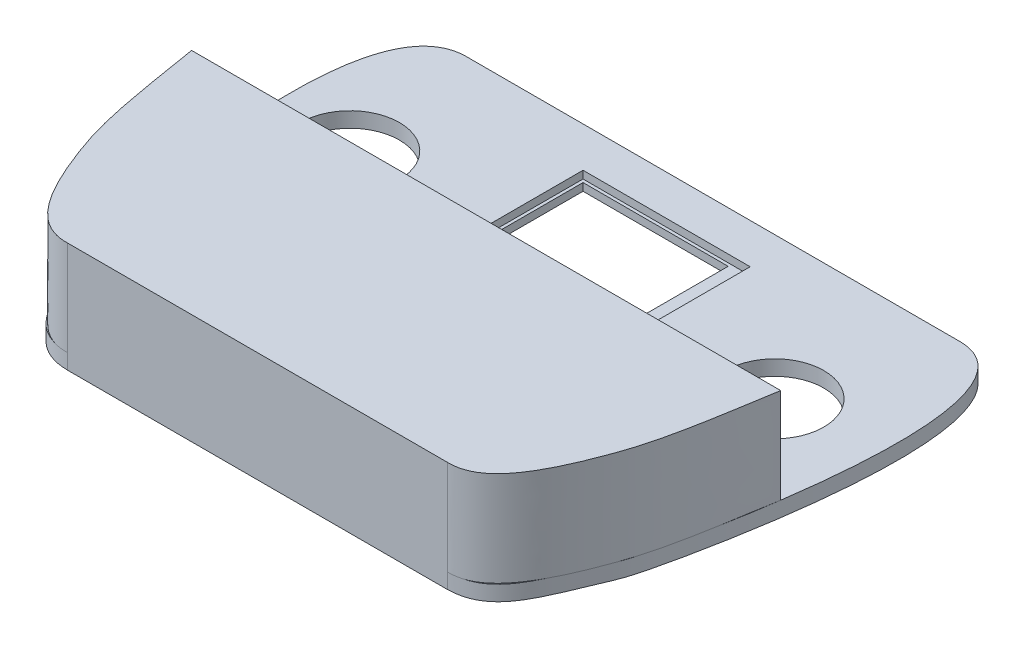
ISO-10303-21;
HEADER;
FILE_DESCRIPTION(('STEP AP214'),'2;1');
FILE_NAME('part.step','',(''),(''),'','','');
FILE_SCHEMA(('AUTOMOTIVE_DESIGN { 1 0 10303 214 1 1 1 1 }'));
ENDSEC;
DATA;
#1=APPLICATION_CONTEXT('core data for automotive mechanical design processes');
#2=APPLICATION_PROTOCOL_DEFINITION('international standard','automotive_design',2000,#1);
#3=PRODUCT_CONTEXT('',#1,'mechanical');
#4=PRODUCT('Part','Part','',(#3));
#5=PRODUCT_RELATED_PRODUCT_CATEGORY('part','',(#4));
#6=PRODUCT_DEFINITION_FORMATION('','',#4);
#7=PRODUCT_DEFINITION_CONTEXT('part definition',#1,'design');
#8=PRODUCT_DEFINITION('design','',#6,#7);
#9=PRODUCT_DEFINITION_SHAPE('','',#8);
#10=(LENGTH_UNIT() NAMED_UNIT(*) SI_UNIT(.MILLI.,.METRE.));
#11=(NAMED_UNIT(*) PLANE_ANGLE_UNIT() SI_UNIT($,.RADIAN.));
#12=(NAMED_UNIT(*) SI_UNIT($,.STERADIAN.) SOLID_ANGLE_UNIT());
#13=UNCERTAINTY_MEASURE_WITH_UNIT(LENGTH_MEASURE(1.E-05),#10,'distance_accuracy_value','');
#14=(GEOMETRIC_REPRESENTATION_CONTEXT(3) GLOBAL_UNCERTAINTY_ASSIGNED_CONTEXT((#13)) GLOBAL_UNIT_ASSIGNED_CONTEXT((#10,
#11,#12)) REPRESENTATION_CONTEXT('',''));
#15=CARTESIAN_POINT('',(0.,0.,0.));
#16=DIRECTION('',(0.,0.,1.));
#17=DIRECTION('',(1.,0.,0.));
#18=AXIS2_PLACEMENT_3D('',#15,#16,#17);
#19=CARTESIAN_POINT('',(-65.5104195038231,4.,46.4952465446901));
#20=DIRECTION('',(0.,-1.,0.));
#21=DIRECTION('',(0.,0.,-1.));
#22=AXIS2_PLACEMENT_3D('',#19,#20,#21);
#23=PLANE('',#22);
#24=CARTESIAN_POINT('',(-77.5396166768678,4.,0.));
#25=CARTESIAN_POINT('',(-76.4116603615141,4.,6.46999407680792));
#26=CARTESIAN_POINT('',(-73.8614554543147,4.,24.6314158559924));
#27=CARTESIAN_POINT('',(-64.1387085735231,4.,53.2137220818067));
#28=CARTESIAN_POINT('',(-57.4303115090479,4.,60.4265071030357));
#29=CARTESIAN_POINT('',(-49.9999999999999,4.,60.2352708908472));
#30=B_SPLINE_CURVE_WITH_KNOTS('',3,(#24,#25,#26,#27,#28,#29),.UNSPECIFIED.,.F.,.F.,(4,1,1,4),
(0.,0.260173636760839,0.360173636760839,1.),.UNSPECIFIED.);
#31=CARTESIAN_POINT('',(-71.434782357632,4.,31.4642966165228));
#32=VERTEX_POINT('',#31);
#33=CARTESIAN_POINT('',(-70.0506174245731,4.,35.7189035386999));
#34=VERTEX_POINT('',#33);
#35=EDGE_CURVE('E11',#32,#34,#30,.T.);
#36=ORIENTED_EDGE('',*,*,#35,.F.);
#37=CARTESIAN_POINT('',(-65.,4.,-59.7647291091528));
#38=CARTESIAN_POINT('',(-88.687727136185,4.,-59.7144912745306));
#39=CARTESIAN_POINT('',(-73.4221929100476,4.,28.0966011781374));
#40=CARTESIAN_POINT('',(-64.1790903338994,4.,48.9805520434913));
#41=CARTESIAN_POINT('',(-61.1512041983117,4.,60.0099305681211));
#42=CARTESIAN_POINT('',(-50.,4.,60.2352708908472));
#43=B_SPLINE_CURVE_WITH_KNOTS('',3,(#37,#38,#39,#40,#41,#42),.UNSPECIFIED.,.F.,.F.,(4,1,1,4),
(0.,0.225756085088067,0.325756085088067,1.),.UNSPECIFIED.);
#44=EDGE_CURVE('E491',#32,#34,#43,.T.);
#45=ORIENTED_EDGE('',*,*,#44,.T.);
#46=EDGE_LOOP('',(#36,#45));
#47=FACE_BOUND('',#46,.T.);
#48=ADVANCED_FACE('F33',(#47),#23,.F.);
#49=CARTESIAN_POINT('',(-64.4027355934482,4.,48.8978222012267));
#50=VERTEX_POINT('',#49);
#51=CARTESIAN_POINT('',(-53.5502601875537,4.,59.7879798173048));
#52=VERTEX_POINT('',#51);
#53=EDGE_CURVE('E43',#50,#52,#30,.T.);
#54=ORIENTED_EDGE('',*,*,#53,.F.);
#55=EDGE_CURVE('E488',#50,#52,#43,.T.);
#56=ORIENTED_EDGE('',*,*,#55,.T.);
#57=EDGE_LOOP('',(#54,#56));
#58=FACE_BOUND('',#57,.T.);
#59=ADVANCED_FACE('F320',(#58),#23,.F.);
#60=CARTESIAN_POINT('',(49.9999999999999,4.,60.2352708908472));
#61=CARTESIAN_POINT('',(57.4303115090479,4.,60.4265071030357));
#62=CARTESIAN_POINT('',(64.1387085735231,4.,53.2137220818066));
#63=CARTESIAN_POINT('',(73.8614554543147,4.,24.6314158559924));
#64=CARTESIAN_POINT('',(76.4116603615141,4.,6.4699940768079));
#65=CARTESIAN_POINT('',(77.5396166768678,4.,0.));
#66=B_SPLINE_CURVE_WITH_KNOTS('',3,(#60,#61,#62,#63,#64,#65),.UNSPECIFIED.,.F.,.F.,(4,1,1,4),
(0.,0.639826363239161,0.739826363239161,1.),.UNSPECIFIED.);
#67=CARTESIAN_POINT('',(53.5502601875538,4.,59.7879798173048));
#68=VERTEX_POINT('',#67);
#69=CARTESIAN_POINT('',(64.402735593448,4.,48.8978222012271));
#70=VERTEX_POINT('',#69);
#71=EDGE_CURVE('E720',#68,#70,#66,.T.);
#72=ORIENTED_EDGE('',*,*,#71,.F.);
#73=CARTESIAN_POINT('',(50.,4.,60.2352708908472));
#74=CARTESIAN_POINT('',(61.1512041983117,4.,60.009930568121));
#75=CARTESIAN_POINT('',(64.1790903338994,4.,48.9805520434913));
#76=CARTESIAN_POINT('',(73.4221929100476,4.,28.0966011781374));
#77=CARTESIAN_POINT('',(88.687727136185,4.,-59.7144912745307));
#78=CARTESIAN_POINT('',(65.,4.,-59.7647291091528));
#79=B_SPLINE_CURVE_WITH_KNOTS('',3,(#73,#74,#75,#76,#77,#78),.UNSPECIFIED.,.F.,.F.,(4,1,1,4),
(0.,0.674243914911933,0.774243914911933,1.),.UNSPECIFIED.);
#80=EDGE_CURVE('E302',#68,#70,#79,.T.);
#81=ORIENTED_EDGE('',*,*,#80,.T.);
#82=EDGE_LOOP('',(#72,#81));
#83=FACE_BOUND('',#82,.T.);
#84=ADVANCED_FACE('F327',(#83),#23,.F.);
#85=CARTESIAN_POINT('',(70.0506174247562,4.,35.7189035382421));
#86=VERTEX_POINT('',#85);
#87=CARTESIAN_POINT('',(71.4347822708162,4.,31.4642969335406));
#88=VERTEX_POINT('',#87);
#89=EDGE_CURVE('E367',#86,#88,#66,.T.);
#90=ORIENTED_EDGE('',*,*,#89,.F.);
#91=EDGE_CURVE('E712',#86,#88,#79,.T.);
#92=ORIENTED_EDGE('',*,*,#91,.T.);
#93=EDGE_LOOP('',(#90,#92));
#94=FACE_BOUND('',#93,.T.);
#95=ADVANCED_FACE('F343',(#94),#23,.F.);
#96=CARTESIAN_POINT('',(-77.5396166760654,4.,5.61940858428978E-09));
#97=VERTEX_POINT('',#96);
#98=CARTESIAN_POINT('',(-75.1901532196157,4.,14.2119829903437));
#99=VERTEX_POINT('',#98);
#100=EDGE_CURVE('E375',#97,#99,#30,.T.);
#101=ORIENTED_EDGE('',*,*,#100,.F.);
#102=EDGE_CURVE('E290',#97,#99,#43,.T.);
#103=ORIENTED_EDGE('',*,*,#102,.T.);
#104=EDGE_LOOP('',(#101,#103));
#105=FACE_BOUND('',#104,.T.);
#106=ADVANCED_FACE('F338',(#105),#23,.F.);
#107=DIRECTION('',(0.,0.,-1.));
#108=VECTOR('',#107,1.);
#109=CARTESIAN_POINT('',(-23.7,4.,-49.2047291091528));
#110=LINE('',#109,#108);
#111=CARTESIAN_POINT('',(-23.7,4.,-15.2047291091528));
#112=VERTEX_POINT('',#111);
#113=CARTESIAN_POINT('',(-23.7,4.,-49.2047291091528));
#114=VERTEX_POINT('',#113);
#115=EDGE_CURVE('E234',#112,#114,#110,.T.);
#116=ORIENTED_EDGE('',*,*,#115,.T.);
#117=DIRECTION('',(1.,0.,0.));
#118=VECTOR('',#117,1.);
#119=CARTESIAN_POINT('',(20.3,4.,-49.2047291091528));
#120=LINE('',#119,#118);
#121=CARTESIAN_POINT('',(20.3,4.,-49.2047291091528));
#122=VERTEX_POINT('',#121);
#123=EDGE_CURVE('E254',#114,#122,#120,.T.);
#124=ORIENTED_EDGE('',*,*,#123,.T.);
#125=DIRECTION('',(0.,0.,1.));
#126=VECTOR('',#125,1.);
#127=CARTESIAN_POINT('',(20.3,4.,-49.2047291091528));
#128=LINE('',#127,#126);
#129=CARTESIAN_POINT('',(20.3,4.,-15.2047291091528));
#130=VERTEX_POINT('',#129);
#131=EDGE_CURVE('E257',#122,#130,#128,.T.);
#132=ORIENTED_EDGE('',*,*,#131,.T.);
#133=DIRECTION('',(-1.,0.,0.));
#134=VECTOR('',#133,1.);
#135=CARTESIAN_POINT('',(20.3,4.,-15.2047291091528));
#136=LINE('',#135,#134);
#137=EDGE_CURVE('E245',#130,#112,#136,.T.);
#138=ORIENTED_EDGE('',*,*,#137,.T.);
#139=EDGE_LOOP('',(#116,#124,#132,#138));
#140=FACE_BOUND('',#139,.T.);
#141=CARTESIAN_POINT('',(-58.7592294032069,4.,-22.9147291092067));
#142=DIRECTION('',(0.,-1.,0.));
#143=DIRECTION('',(0.,0.,-1.));
#144=AXIS2_PLACEMENT_3D('',#141,#142,#143);
#145=CIRCLE('',#144,13.);
#146=CARTESIAN_POINT('',(-58.7592294032069,4.,-35.9147291092067));
#147=VERTEX_POINT('',#146);
#148=EDGE_CURVE('E272',#147,#147,#145,.T.);
#149=ORIENTED_EDGE('',*,*,#148,.T.);
#150=EDGE_LOOP('',(#149));
#151=FACE_BOUND('',#150,.T.);
#152=CARTESIAN_POINT('',(53.6456654675596,4.,-22.3397291092176));
#153=DIRECTION('',(0.,-1.,0.));
#154=DIRECTION('',(0.,0.,-1.));
#155=AXIS2_PLACEMENT_3D('',#152,#153,#154);
#156=CIRCLE('',#155,12.9003137032493);
#157=CARTESIAN_POINT('',(53.6456654675596,4.,-35.240042812467));
#158=VERTEX_POINT('',#157);
#159=EDGE_CURVE('E271',#158,#158,#156,.T.);
#160=ORIENTED_EDGE('',*,*,#159,.T.);
#161=EDGE_LOOP('',(#160));
#162=FACE_BOUND('',#161,.T.);
#163=DIRECTION('',(-1.,0.,0.));
#164=VECTOR('',#163,1.);
#165=CARTESIAN_POINT('',(-77.5396166768678,4.,0.));
#166=LINE('',#165,#164);
#167=CARTESIAN_POINT('',(77.5396166768678,4.,0.));
#168=VERTEX_POINT('',#167);
#169=EDGE_CURVE('E195',#168,#97,#166,.T.);
#170=ORIENTED_EDGE('',*,*,#169,.F.);
#171=CARTESIAN_POINT('',(65.,4.,-59.7647291091528));
#172=VERTEX_POINT('',#171);
#173=EDGE_CURVE('E289',#168,#172,#79,.T.);
#174=ORIENTED_EDGE('',*,*,#173,.T.);
#175=DIRECTION('',(-1.,0.,0.));
#176=VECTOR('',#175,1.);
#177=CARTESIAN_POINT('',(-65.,4.,-59.7647291091528));
#178=LINE('',#177,#176);
#179=CARTESIAN_POINT('',(-65.,4.,-59.7647291091528));
#180=VERTEX_POINT('',#179);
#181=EDGE_CURVE('E301',#172,#180,#178,.T.);
#182=ORIENTED_EDGE('',*,*,#181,.T.);
#183=EDGE_CURVE('E283',#180,#97,#43,.T.);
#184=ORIENTED_EDGE('',*,*,#183,.T.);
#185=EDGE_LOOP('',(#170,#174,#182,#184));
#186=FACE_BOUND('',#185,.T.);
#187=ADVANCED_FACE('F331',(#140,#151,#162,#186),#23,.F.);
#188=CARTESIAN_POINT('',(75.1901532196171,4.,14.2119829903365));
#189=VERTEX_POINT('',#188);
#190=EDGE_CURVE('E51',#189,#168,#66,.T.);
#191=ORIENTED_EDGE('',*,*,#190,.F.);
#192=EDGE_CURVE('E711',#189,#168,#79,.T.);
#193=ORIENTED_EDGE('',*,*,#192,.T.);
#194=EDGE_LOOP('',(#191,#193));
#195=FACE_BOUND('',#194,.T.);
#196=ADVANCED_FACE('F323',(#195),#23,.F.);
#197=CARTESIAN_POINT('',(0.,2.,0.));
#198=DIRECTION('',(0.,-1.,0.));
#199=DIRECTION('',(0.,0.,-1.));
#200=AXIS2_PLACEMENT_3D('',#197,#198,#199);
#201=PLANE('',#200);
#202=DIRECTION('',(0.,0.,-1.));
#203=VECTOR('',#202,1.);
#204=CARTESIAN_POINT('',(-23.7,2.,-49.2047291091528));
#205=LINE('',#204,#203);
#206=CARTESIAN_POINT('',(-23.7,2.,-15.2047291091528));
#207=VERTEX_POINT('',#206);
#208=CARTESIAN_POINT('',(-23.7,2.,-49.2047291091528));
#209=VERTEX_POINT('',#208);
#210=EDGE_CURVE('E241',#207,#209,#205,.T.);
#211=ORIENTED_EDGE('',*,*,#210,.F.);
#212=DIRECTION('',(-1.,0.,0.));
#213=VECTOR('',#212,1.);
#214=CARTESIAN_POINT('',(20.3,2.,-15.2047291091528));
#215=LINE('',#214,#213);
#216=CARTESIAN_POINT('',(20.3,2.,-15.2047291091528));
#217=VERTEX_POINT('',#216);
#218=EDGE_CURVE('E249',#217,#207,#215,.T.);
#219=ORIENTED_EDGE('',*,*,#218,.F.);
#220=DIRECTION('',(0.,0.,1.));
#221=VECTOR('',#220,1.);
#222=CARTESIAN_POINT('',(20.3,2.,-49.2047291091528));
#223=LINE('',#222,#221);
#224=CARTESIAN_POINT('',(20.3,2.,-49.2047291091528));
#225=VERTEX_POINT('',#224);
#226=EDGE_CURVE('E247',#225,#217,#223,.T.);
#227=ORIENTED_EDGE('',*,*,#226,.F.);
#228=DIRECTION('',(1.,0.,0.));
#229=VECTOR('',#228,1.);
#230=CARTESIAN_POINT('',(20.3,2.,-49.2047291091528));
#231=LINE('',#230,#229);
#232=EDGE_CURVE('E244',#209,#225,#231,.T.);
#233=ORIENTED_EDGE('',*,*,#232,.F.);
#234=EDGE_LOOP('',(#211,#219,#227,#233));
#235=FACE_BOUND('',#234,.T.);
#236=DIRECTION('',(-1.,0.,0.));
#237=VECTOR('',#236,1.);
#238=CARTESIAN_POINT('',(15.3,2.,-48.4047291091528));
#239=LINE('',#238,#237);
#240=CARTESIAN_POINT('',(15.3,2.,-48.4047291091528));
#241=VERTEX_POINT('',#240);
#242=CARTESIAN_POINT('',(-22.9,2.,-48.4047291091528));
#243=VERTEX_POINT('',#242);
#244=EDGE_CURVE('E203',#241,#243,#239,.T.);
#245=ORIENTED_EDGE('',*,*,#244,.F.);
#246=DIRECTION('',(0.,0.,-1.));
#247=VECTOR('',#246,1.);
#248=CARTESIAN_POINT('',(15.3,2.,-48.4047291091528));
#249=LINE('',#248,#247);
#250=CARTESIAN_POINT('',(15.3,2.,-16.0047291091528));
#251=VERTEX_POINT('',#250);
#252=EDGE_CURVE('E216',#251,#241,#249,.T.);
#253=ORIENTED_EDGE('',*,*,#252,.F.);
#254=DIRECTION('',(1.,0.,0.));
#255=VECTOR('',#254,1.);
#256=CARTESIAN_POINT('',(-22.9,2.,-16.0047291091528));
#257=LINE('',#256,#255);
#258=CARTESIAN_POINT('',(-22.9,2.,-16.0047291091528));
#259=VERTEX_POINT('',#258);
#260=EDGE_CURVE('E228',#259,#251,#257,.T.);
#261=ORIENTED_EDGE('',*,*,#260,.F.);
#262=DIRECTION('',(0.,0.,1.));
#263=VECTOR('',#262,1.);
#264=CARTESIAN_POINT('',(-22.9,2.,-48.4047291091528));
#265=LINE('',#264,#263);
#266=EDGE_CURVE('E206',#243,#259,#265,.T.);
#267=ORIENTED_EDGE('',*,*,#266,.F.);
#268=EDGE_LOOP('',(#245,#253,#261,#267));
#269=FACE_BOUND('',#268,.T.);
#270=ADVANCED_FACE('F317',(#235,#269),#201,.F.);
#271=DIRECTION('',(0.,-1.,0.));
#272=VECTOR('',#271,1.);
#273=SURFACE_OF_LINEAR_EXTRUSION('',#43,#272);
#274=CARTESIAN_POINT('',(-65.,0.,-59.7647291091528));
#275=CARTESIAN_POINT('',(-88.687727136185,0.,-59.7144912745306));
#276=CARTESIAN_POINT('',(-73.4221929100476,0.,28.0966011781374));
#277=CARTESIAN_POINT('',(-64.1790903338994,0.,48.9805520434913));
#278=CARTESIAN_POINT('',(-61.1512041983117,0.,60.0099305681211));
#279=CARTESIAN_POINT('',(-50.,0.,60.2352708908472));
#280=B_SPLINE_CURVE_WITH_KNOTS('',3,(#274,#275,#276,#277,#278,#279),.UNSPECIFIED.,.F.,.F.,(4,1,
1,4),(0.,0.225756085088067,0.325756085088067,1.),.UNSPECIFIED.);
#281=CARTESIAN_POINT('',(-65.,0.,-59.7647291091528));
#282=VERTEX_POINT('',#281);
#283=CARTESIAN_POINT('',(-50.,0.,60.2352708908472));
#284=VERTEX_POINT('',#283);
#285=EDGE_CURVE('E275',#282,#284,#280,.T.);
#286=ORIENTED_EDGE('',*,*,#285,.T.);
#287=DIRECTION('',(0.,-1.,0.));
#288=VECTOR('',#287,1.);
#289=CARTESIAN_POINT('',(-50.,4.,60.2352708908472));
#290=LINE('',#289,#288);
#291=CARTESIAN_POINT('',(-50.,4.,60.2352708908472));
#292=VERTEX_POINT('',#291);
#293=EDGE_CURVE('E38',#292,#284,#290,.T.);
#294=ORIENTED_EDGE('',*,*,#293,.F.);
#295=EDGE_CURVE('E291',#52,#292,#43,.T.);
#296=ORIENTED_EDGE('',*,*,#295,.F.);
#297=ORIENTED_EDGE('',*,*,#55,.F.);
#298=EDGE_CURVE('E489',#34,#50,#43,.T.);
#299=ORIENTED_EDGE('',*,*,#298,.F.);
#300=ORIENTED_EDGE('',*,*,#44,.F.);
#301=EDGE_CURVE('E496',#99,#32,#43,.T.);
#302=ORIENTED_EDGE('',*,*,#301,.F.);
#303=ORIENTED_EDGE('',*,*,#102,.F.);
#304=ORIENTED_EDGE('',*,*,#183,.F.);
#305=DIRECTION('',(0.,-1.,0.));
#306=VECTOR('',#305,1.);
#307=CARTESIAN_POINT('',(-65.,4.,-59.7647291091528));
#308=LINE('',#307,#306);
#309=EDGE_CURVE('E476',#180,#282,#308,.T.);
#310=ORIENTED_EDGE('',*,*,#309,.T.);
#311=EDGE_LOOP('',(#286,#294,#296,#297,#299,#300,#302,#303,#304,#310));
#312=FACE_BOUND('',#311,.T.);
#313=ADVANCED_FACE('F35',(#312),#273,.F.);
#314=CARTESIAN_POINT('',(-50.,4.,60.2352708908472));
#315=DIRECTION('',(0.,0.,-1.));
#316=DIRECTION('',(-1.,0.,0.));
#317=AXIS2_PLACEMENT_3D('',#314,#315,#316);
#318=PLANE('',#317);
#319=DIRECTION('',(1.,0.,0.));
#320=VECTOR('',#319,1.);
#321=CARTESIAN_POINT('',(-50.,0.,60.2352708908472));
#322=LINE('',#321,#320);
#323=CARTESIAN_POINT('',(50.,0.,60.2352708908472));
#324=VERTEX_POINT('',#323);
#325=EDGE_CURVE('E459',#284,#324,#322,.T.);
#326=ORIENTED_EDGE('',*,*,#325,.T.);
#327=DIRECTION('',(0.,-1.,0.));
#328=VECTOR('',#327,1.);
#329=CARTESIAN_POINT('',(50.,4.,60.2352708908472));
#330=LINE('',#329,#328);
#331=CARTESIAN_POINT('',(50.,4.,60.2352708908472));
#332=VERTEX_POINT('',#331);
#333=EDGE_CURVE('E480',#332,#324,#330,.T.);
#334=ORIENTED_EDGE('',*,*,#333,.F.);
#335=DIRECTION('',(0.,-1.,0.));
#336=VECTOR('',#335,1.);
#337=CARTESIAN_POINT('',(50.,29.,60.2352708908472));
#338=LINE('',#337,#336);
#339=CARTESIAN_POINT('',(50.,29.,60.2352708908472));
#340=VERTEX_POINT('',#339);
#341=EDGE_CURVE('E182',#340,#332,#338,.T.);
#342=ORIENTED_EDGE('',*,*,#341,.F.);
#343=DIRECTION('',(1.,0.,0.));
#344=VECTOR('',#343,1.);
#345=CARTESIAN_POINT('',(-50.,29.,60.2352708908472));
#346=LINE('',#345,#344);
#347=CARTESIAN_POINT('',(-50.,29.,60.2352708908472));
#348=VERTEX_POINT('',#347);
#349=EDGE_CURVE('E175',#348,#340,#346,.T.);
#350=ORIENTED_EDGE('',*,*,#349,.F.);
#351=DIRECTION('',(0.,-1.,0.));
#352=VECTOR('',#351,1.);
#353=CARTESIAN_POINT('',(-50.,29.,60.2352708908472));
#354=LINE('',#353,#352);
#355=EDGE_CURVE('E180',#348,#292,#354,.T.);
#356=ORIENTED_EDGE('',*,*,#355,.T.);
#357=ORIENTED_EDGE('',*,*,#293,.T.);
#358=EDGE_LOOP('',(#326,#334,#342,#350,#356,#357));
#359=FACE_BOUND('',#358,.T.);
#360=ADVANCED_FACE('F177',(#359),#318,.F.);
#361=DIRECTION('',(0.,-1.,0.));
#362=VECTOR('',#361,1.);
#363=SURFACE_OF_LINEAR_EXTRUSION('',#79,#362);
#364=CARTESIAN_POINT('',(50.,0.,60.2352708908472));
#365=CARTESIAN_POINT('',(61.1512041983117,0.,60.009930568121));
#366=CARTESIAN_POINT('',(64.1790903338994,0.,48.9805520434913));
#367=CARTESIAN_POINT('',(73.4221929100476,0.,28.0966011781374));
#368=CARTESIAN_POINT('',(88.687727136185,0.,-59.7144912745307));
#369=CARTESIAN_POINT('',(65.,0.,-59.7647291091528));
#370=B_SPLINE_CURVE_WITH_KNOTS('',3,(#364,#365,#366,#367,#368,#369),.UNSPECIFIED.,.F.,.F.,(4,1,
1,4),(0.,0.674243914911933,0.774243914911933,1.),.UNSPECIFIED.);
#371=CARTESIAN_POINT('',(65.,0.,-59.7647291091528));
#372=VERTEX_POINT('',#371);
#373=EDGE_CURVE('E461',#324,#372,#370,.T.);
#374=ORIENTED_EDGE('',*,*,#373,.T.);
#375=DIRECTION('',(0.,-1.,0.));
#376=VECTOR('',#375,1.);
#377=CARTESIAN_POINT('',(65.,4.,-59.7647291091528));
#378=LINE('',#377,#376);
#379=EDGE_CURVE('E478',#172,#372,#378,.T.);
#380=ORIENTED_EDGE('',*,*,#379,.F.);
#381=ORIENTED_EDGE('',*,*,#173,.F.);
#382=ORIENTED_EDGE('',*,*,#192,.F.);
#383=EDGE_CURVE('E58',#88,#189,#79,.T.);
#384=ORIENTED_EDGE('',*,*,#383,.F.);
#385=ORIENTED_EDGE('',*,*,#91,.F.);
#386=EDGE_CURVE('E713',#70,#86,#79,.T.);
#387=ORIENTED_EDGE('',*,*,#386,.F.);
#388=ORIENTED_EDGE('',*,*,#80,.F.);
#389=EDGE_CURVE('E292',#332,#68,#79,.T.);
#390=ORIENTED_EDGE('',*,*,#389,.F.);
#391=ORIENTED_EDGE('',*,*,#333,.T.);
#392=EDGE_LOOP('',(#374,#380,#381,#382,#384,#385,#387,#388,#390,#391));
#393=FACE_BOUND('',#392,.T.);
#394=ADVANCED_FACE('F308',(#393),#363,.F.);
#395=CARTESIAN_POINT('',(-65.,4.,-59.7647291091528));
#396=DIRECTION('',(0.,0.,1.));
#397=DIRECTION('',(1.,0.,0.));
#398=AXIS2_PLACEMENT_3D('',#395,#396,#397);
#399=PLANE('',#398);
#400=DIRECTION('',(-1.,0.,0.));
#401=VECTOR('',#400,1.);
#402=CARTESIAN_POINT('',(-65.,0.,-59.7647291091528));
#403=LINE('',#402,#401);
#404=EDGE_CURVE('E458',#372,#282,#403,.T.);
#405=ORIENTED_EDGE('',*,*,#404,.T.);
#406=ORIENTED_EDGE('',*,*,#309,.F.);
#407=ORIENTED_EDGE('',*,*,#181,.F.);
#408=ORIENTED_EDGE('',*,*,#379,.T.);
#409=EDGE_LOOP('',(#405,#406,#407,#408));
#410=FACE_BOUND('',#409,.T.);
#411=ADVANCED_FACE('F311',(#410),#399,.F.);
#412=CARTESIAN_POINT('',(-65.5104195038231,0.,46.4952465446901));
#413=DIRECTION('',(0.,-1.,0.));
#414=DIRECTION('',(0.,0.,-1.));
#415=AXIS2_PLACEMENT_3D('',#412,#413,#414);
#416=PLANE('',#415);
#417=DIRECTION('',(-1.,0.,0.));
#418=VECTOR('',#417,1.);
#419=CARTESIAN_POINT('',(15.3,0.,-48.4047291091528));
#420=LINE('',#419,#418);
#421=CARTESIAN_POINT('',(15.3,0.,-48.4047291091528));
#422=VERTEX_POINT('',#421);
#423=CARTESIAN_POINT('',(-22.9,0.,-48.4047291091528));
#424=VERTEX_POINT('',#423);
#425=EDGE_CURVE('E212',#422,#424,#420,.T.);
#426=ORIENTED_EDGE('',*,*,#425,.T.);
#427=DIRECTION('',(0.,0.,1.));
#428=VECTOR('',#427,1.);
#429=CARTESIAN_POINT('',(-22.9,0.,-48.4047291091528));
#430=LINE('',#429,#428);
#431=CARTESIAN_POINT('',(-22.9,0.,-16.0047291091528));
#432=VERTEX_POINT('',#431);
#433=EDGE_CURVE('E215',#424,#432,#430,.T.);
#434=ORIENTED_EDGE('',*,*,#433,.T.);
#435=DIRECTION('',(1.,0.,0.));
#436=VECTOR('',#435,1.);
#437=CARTESIAN_POINT('',(-22.9,0.,-16.0047291091528));
#438=LINE('',#437,#436);
#439=CARTESIAN_POINT('',(15.3,0.,-16.0047291091528));
#440=VERTEX_POINT('',#439);
#441=EDGE_CURVE('E219',#432,#440,#438,.T.);
#442=ORIENTED_EDGE('',*,*,#441,.T.);
#443=DIRECTION('',(0.,0.,-1.));
#444=VECTOR('',#443,1.);
#445=CARTESIAN_POINT('',(15.3,0.,-48.4047291091528));
#446=LINE('',#445,#444);
#447=EDGE_CURVE('E222',#440,#422,#446,.T.);
#448=ORIENTED_EDGE('',*,*,#447,.T.);
#449=EDGE_LOOP('',(#426,#434,#442,#448));
#450=FACE_BOUND('',#449,.T.);
#451=CARTESIAN_POINT('',(-58.7592294032069,0.,-22.9147291092067));
#452=DIRECTION('',(0.,-1.,0.));
#453=DIRECTION('',(0.,0.,-1.));
#454=AXIS2_PLACEMENT_3D('',#451,#452,#453);
#455=CIRCLE('',#454,13.);
#456=CARTESIAN_POINT('',(-58.7592294032069,0.,-35.9147291092067));
#457=VERTEX_POINT('',#456);
#458=EDGE_CURVE('E276',#457,#457,#455,.T.);
#459=ORIENTED_EDGE('',*,*,#458,.F.);
#460=EDGE_LOOP('',(#459));
#461=FACE_BOUND('',#460,.T.);
#462=CARTESIAN_POINT('',(53.6456654675596,0.,-22.3397291092176));
#463=DIRECTION('',(0.,-1.,0.));
#464=DIRECTION('',(0.,0.,-1.));
#465=AXIS2_PLACEMENT_3D('',#462,#463,#464);
#466=CIRCLE('',#465,12.9003137032493);
#467=CARTESIAN_POINT('',(53.6456654675596,0.,-35.240042812467));
#468=VERTEX_POINT('',#467);
#469=EDGE_CURVE('E279',#468,#468,#466,.T.);
#470=ORIENTED_EDGE('',*,*,#469,.F.);
#471=EDGE_LOOP('',(#470));
#472=FACE_BOUND('',#471,.T.);
#473=ORIENTED_EDGE('',*,*,#285,.F.);
#474=ORIENTED_EDGE('',*,*,#404,.F.);
#475=ORIENTED_EDGE('',*,*,#373,.F.);
#476=ORIENTED_EDGE('',*,*,#325,.F.);
#477=EDGE_LOOP('',(#473,#474,#475,#476));
#478=FACE_BOUND('',#477,.T.);
#479=ADVANCED_FACE('F444',(#450,#461,#472,#478),#416,.T.);
#480=CARTESIAN_POINT('',(53.6456654675596,4.,-22.3397291092176));
#481=DIRECTION('',(0.,-1.,0.));
#482=DIRECTION('',(0.,0.,-1.));
#483=AXIS2_PLACEMENT_3D('',#480,#481,#482);
#484=CYLINDRICAL_SURFACE('',#483,12.9003137032493);
#485=ORIENTED_EDGE('',*,*,#159,.F.);
#486=EDGE_LOOP('',(#485));
#487=FACE_BOUND('',#486,.T.);
#488=ORIENTED_EDGE('',*,*,#469,.T.);
#489=EDGE_LOOP('',(#488));
#490=FACE_BOUND('',#489,.T.);
#491=ADVANCED_FACE('F441',(#487,#490),#484,.F.);
#492=CARTESIAN_POINT('',(-58.7592294032069,4.,-22.9147291092067));
#493=DIRECTION('',(0.,-1.,0.));
#494=DIRECTION('',(0.,0.,-1.));
#495=AXIS2_PLACEMENT_3D('',#492,#493,#494);
#496=CYLINDRICAL_SURFACE('',#495,13.);
#497=ORIENTED_EDGE('',*,*,#148,.F.);
#498=EDGE_LOOP('',(#497));
#499=FACE_BOUND('',#498,.T.);
#500=ORIENTED_EDGE('',*,*,#458,.T.);
#501=EDGE_LOOP('',(#500));
#502=FACE_BOUND('',#501,.T.);
#503=ADVANCED_FACE('F438',(#499,#502),#496,.F.);
#504=CARTESIAN_POINT('',(-23.7,2.,-49.2047291091528));
#505=DIRECTION('',(1.,0.,0.));
#506=DIRECTION('',(0.,0.,-1.));
#507=AXIS2_PLACEMENT_3D('',#504,#505,#506);
#508=PLANE('',#507);
#509=ORIENTED_EDGE('',*,*,#115,.F.);
#510=DIRECTION('',(0.,1.,0.));
#511=VECTOR('',#510,1.);
#512=CARTESIAN_POINT('',(-23.7,2.,-15.2047291091528));
#513=LINE('',#512,#511);
#514=EDGE_CURVE('E251',#207,#112,#513,.T.);
#515=ORIENTED_EDGE('',*,*,#514,.F.);
#516=ORIENTED_EDGE('',*,*,#210,.T.);
#517=DIRECTION('',(0.,1.,0.));
#518=VECTOR('',#517,1.);
#519=CARTESIAN_POINT('',(-23.7,2.,-49.2047291091528));
#520=LINE('',#519,#518);
#521=EDGE_CURVE('E268',#209,#114,#520,.T.);
#522=ORIENTED_EDGE('',*,*,#521,.T.);
#523=EDGE_LOOP('',(#509,#515,#516,#522));
#524=FACE_BOUND('',#523,.T.);
#525=ADVANCED_FACE('F434',(#524),#508,.T.);
#526=CARTESIAN_POINT('',(20.3,2.,-49.2047291091528));
#527=DIRECTION('',(0.,0.,1.));
#528=DIRECTION('',(1.,0.,0.));
#529=AXIS2_PLACEMENT_3D('',#526,#527,#528);
#530=PLANE('',#529);
#531=ORIENTED_EDGE('',*,*,#123,.F.);
#532=ORIENTED_EDGE('',*,*,#521,.F.);
#533=ORIENTED_EDGE('',*,*,#232,.T.);
#534=DIRECTION('',(0.,1.,0.));
#535=VECTOR('',#534,1.);
#536=CARTESIAN_POINT('',(20.3,2.,-49.2047291091528));
#537=LINE('',#536,#535);
#538=EDGE_CURVE('E266',#225,#122,#537,.T.);
#539=ORIENTED_EDGE('',*,*,#538,.T.);
#540=EDGE_LOOP('',(#531,#532,#533,#539));
#541=FACE_BOUND('',#540,.T.);
#542=ADVANCED_FACE('F430',(#541),#530,.T.);
#543=CARTESIAN_POINT('',(20.3,2.,-49.2047291091528));
#544=DIRECTION('',(-1.,0.,0.));
#545=DIRECTION('',(0.,0.,1.));
#546=AXIS2_PLACEMENT_3D('',#543,#544,#545);
#547=PLANE('',#546);
#548=ORIENTED_EDGE('',*,*,#131,.F.);
#549=ORIENTED_EDGE('',*,*,#538,.F.);
#550=ORIENTED_EDGE('',*,*,#226,.T.);
#551=DIRECTION('',(0.,1.,0.));
#552=VECTOR('',#551,1.);
#553=CARTESIAN_POINT('',(20.3,2.,-15.2047291091528));
#554=LINE('',#553,#552);
#555=EDGE_CURVE('E264',#217,#130,#554,.T.);
#556=ORIENTED_EDGE('',*,*,#555,.T.);
#557=EDGE_LOOP('',(#548,#549,#550,#556));
#558=FACE_BOUND('',#557,.T.);
#559=ADVANCED_FACE('F426',(#558),#547,.T.);
#560=CARTESIAN_POINT('',(20.3,2.,-15.2047291091528));
#561=DIRECTION('',(0.,0.,-1.));
#562=DIRECTION('',(-1.,0.,0.));
#563=AXIS2_PLACEMENT_3D('',#560,#561,#562);
#564=PLANE('',#563);
#565=ORIENTED_EDGE('',*,*,#137,.F.);
#566=ORIENTED_EDGE('',*,*,#555,.F.);
#567=ORIENTED_EDGE('',*,*,#218,.T.);
#568=ORIENTED_EDGE('',*,*,#514,.T.);
#569=EDGE_LOOP('',(#565,#566,#567,#568));
#570=FACE_BOUND('',#569,.T.);
#571=ADVANCED_FACE('F421',(#570),#564,.T.);
#572=CARTESIAN_POINT('',(15.3,0.,-48.4047291091528));
#573=DIRECTION('',(0.,0.,-1.));
#574=DIRECTION('',(-1.,0.,0.));
#575=AXIS2_PLACEMENT_3D('',#572,#573,#574);
#576=PLANE('',#575);
#577=ORIENTED_EDGE('',*,*,#244,.T.);
#578=DIRECTION('',(0.,1.,0.));
#579=VECTOR('',#578,1.);
#580=CARTESIAN_POINT('',(-22.9,0.,-48.4047291091528));
#581=LINE('',#580,#579);
#582=EDGE_CURVE('E224',#424,#243,#581,.T.);
#583=ORIENTED_EDGE('',*,*,#582,.F.);
#584=ORIENTED_EDGE('',*,*,#425,.F.);
#585=DIRECTION('',(0.,1.,0.));
#586=VECTOR('',#585,1.);
#587=CARTESIAN_POINT('',(15.3,0.,-48.4047291091528));
#588=LINE('',#587,#586);
#589=EDGE_CURVE('E232',#422,#241,#588,.T.);
#590=ORIENTED_EDGE('',*,*,#589,.T.);
#591=EDGE_LOOP('',(#577,#583,#584,#590));
#592=FACE_BOUND('',#591,.T.);
#593=ADVANCED_FACE('F410',(#592),#576,.F.);
#594=CARTESIAN_POINT('',(15.3,0.,-48.4047291091528));
#595=DIRECTION('',(1.,0.,0.));
#596=DIRECTION('',(0.,0.,-1.));
#597=AXIS2_PLACEMENT_3D('',#594,#595,#596);
#598=PLANE('',#597);
#599=ORIENTED_EDGE('',*,*,#252,.T.);
#600=ORIENTED_EDGE('',*,*,#589,.F.);
#601=ORIENTED_EDGE('',*,*,#447,.F.);
#602=DIRECTION('',(0.,1.,0.));
#603=VECTOR('',#602,1.);
#604=CARTESIAN_POINT('',(15.3,0.,-16.0047291091528));
#605=LINE('',#604,#603);
#606=EDGE_CURVE('E235',#440,#251,#605,.T.);
#607=ORIENTED_EDGE('',*,*,#606,.T.);
#608=EDGE_LOOP('',(#599,#600,#601,#607));
#609=FACE_BOUND('',#608,.T.);
#610=ADVANCED_FACE('F400',(#609),#598,.F.);
#611=CARTESIAN_POINT('',(-22.9,0.,-16.0047291091528));
#612=DIRECTION('',(0.,0.,1.));
#613=DIRECTION('',(1.,0.,0.));
#614=AXIS2_PLACEMENT_3D('',#611,#612,#613);
#615=PLANE('',#614);
#616=ORIENTED_EDGE('',*,*,#260,.T.);
#617=ORIENTED_EDGE('',*,*,#606,.F.);
#618=ORIENTED_EDGE('',*,*,#441,.F.);
#619=DIRECTION('',(0.,1.,0.));
#620=VECTOR('',#619,1.);
#621=CARTESIAN_POINT('',(-22.9,0.,-16.0047291091528));
#622=LINE('',#621,#620);
#623=EDGE_CURVE('E238',#432,#259,#622,.T.);
#624=ORIENTED_EDGE('',*,*,#623,.T.);
#625=EDGE_LOOP('',(#616,#617,#618,#624));
#626=FACE_BOUND('',#625,.T.);
#627=ADVANCED_FACE('F409',(#626),#615,.F.);
#628=CARTESIAN_POINT('',(-22.9,0.,-48.4047291091528));
#629=DIRECTION('',(-1.,0.,0.));
#630=DIRECTION('',(0.,0.,1.));
#631=AXIS2_PLACEMENT_3D('',#628,#629,#630);
#632=PLANE('',#631);
#633=ORIENTED_EDGE('',*,*,#266,.T.);
#634=ORIENTED_EDGE('',*,*,#623,.F.);
#635=ORIENTED_EDGE('',*,*,#433,.F.);
#636=ORIENTED_EDGE('',*,*,#582,.T.);
#637=EDGE_LOOP('',(#633,#634,#635,#636));
#638=FACE_BOUND('',#637,.T.);
#639=ADVANCED_FACE('F414',(#638),#632,.F.);
#640=CARTESIAN_POINT('',(-65.3859853461113,4.,47.0000977215902));
#641=DIRECTION('',(0.,1.,0.));
#642=DIRECTION('',(0.,0.,1.));
#643=AXIS2_PLACEMENT_3D('',#640,#641,#642);
#644=PLANE('',#643);
#645=EDGE_CURVE('E45',#99,#32,#30,.T.);
#646=ORIENTED_EDGE('',*,*,#645,.F.);
#647=ORIENTED_EDGE('',*,*,#301,.T.);
#648=EDGE_LOOP('',(#646,#647));
#649=FACE_BOUND('',#648,.T.);
#650=ADVANCED_FACE('F418',(#649),#644,.F.);
#651=EDGE_CURVE('E504',#34,#50,#30,.T.);
#652=ORIENTED_EDGE('',*,*,#651,.F.);
#653=ORIENTED_EDGE('',*,*,#298,.T.);
#654=EDGE_LOOP('',(#652,#653));
#655=FACE_BOUND('',#654,.T.);
#656=ADVANCED_FACE('F505',(#655),#644,.F.);
#657=EDGE_CURVE('E202',#52,#292,#30,.T.);
#658=ORIENTED_EDGE('',*,*,#657,.F.);
#659=ORIENTED_EDGE('',*,*,#295,.T.);
#660=EDGE_LOOP('',(#658,#659));
#661=FACE_BOUND('',#660,.T.);
#662=ADVANCED_FACE('F487',(#661),#644,.F.);
#663=EDGE_CURVE('E357',#332,#68,#66,.T.);
#664=ORIENTED_EDGE('',*,*,#663,.F.);
#665=ORIENTED_EDGE('',*,*,#389,.T.);
#666=EDGE_LOOP('',(#664,#665));
#667=FACE_BOUND('',#666,.T.);
#668=ADVANCED_FACE('F511',(#667),#644,.F.);
#669=EDGE_CURVE('E374',#70,#86,#66,.T.);
#670=ORIENTED_EDGE('',*,*,#669,.F.);
#671=ORIENTED_EDGE('',*,*,#386,.T.);
#672=EDGE_LOOP('',(#670,#671));
#673=FACE_BOUND('',#672,.T.);
#674=ADVANCED_FACE('F533',(#673),#644,.F.);
#675=EDGE_CURVE('E366',#88,#189,#66,.T.);
#676=ORIENTED_EDGE('',*,*,#675,.F.);
#677=ORIENTED_EDGE('',*,*,#383,.T.);
#678=EDGE_LOOP('',(#676,#677));
#679=FACE_BOUND('',#678,.T.);
#680=ADVANCED_FACE('F399',(#679),#644,.F.);
#681=CARTESIAN_POINT('',(-77.5396166768678,29.,0.));
#682=CARTESIAN_POINT('',(-76.4116603615141,29.,6.46999407680792));
#683=CARTESIAN_POINT('',(-73.8614554543147,29.,24.6314158559924));
#684=CARTESIAN_POINT('',(-64.1387085735231,29.,53.2137220818067));
#685=CARTESIAN_POINT('',(-57.4303115090479,29.,60.4265071030357));
#686=CARTESIAN_POINT('',(-49.9999999999999,29.,60.2352708908472));
#687=B_SPLINE_CURVE_WITH_KNOTS('',3,(#681,#682,#683,#684,#685,#686),.UNSPECIFIED.,.F.,.F.,(4,1,
1,4),(0.,0.260173636760839,0.360173636760839,1.),.UNSPECIFIED.);
#688=DIRECTION('',(0.,-1.,0.));
#689=VECTOR('',#688,1.);
#690=SURFACE_OF_LINEAR_EXTRUSION('',#687,#689);
#691=ORIENTED_EDGE('',*,*,#100,.T.);
#692=ORIENTED_EDGE('',*,*,#645,.T.);
#693=ORIENTED_EDGE('',*,*,#35,.T.);
#694=ORIENTED_EDGE('',*,*,#651,.T.);
#695=ORIENTED_EDGE('',*,*,#53,.T.);
#696=ORIENTED_EDGE('',*,*,#657,.T.);
#697=ORIENTED_EDGE('',*,*,#355,.F.);
#698=CARTESIAN_POINT('',(-77.5396166768678,29.,0.));
#699=VERTEX_POINT('',#698);
#700=EDGE_CURVE('E186',#699,#348,#687,.T.);
#701=ORIENTED_EDGE('',*,*,#700,.F.);
#702=DIRECTION('',(0.,-1.,0.));
#703=VECTOR('',#702,1.);
#704=CARTESIAN_POINT('',(-77.5396166768678,29.,0.));
#705=LINE('',#704,#703);
#706=EDGE_CURVE('E370',#699,#97,#705,.T.);
#707=ORIENTED_EDGE('',*,*,#706,.T.);
#708=EDGE_LOOP('',(#691,#692,#693,#694,#695,#696,#697,#701,#707));
#709=FACE_BOUND('',#708,.T.);
#710=ADVANCED_FACE('F199',(#709),#690,.F.);
#711=CARTESIAN_POINT('',(49.9999999999999,29.,60.2352708908472));
#712=CARTESIAN_POINT('',(57.4303115090479,29.,60.4265071030357));
#713=CARTESIAN_POINT('',(64.1387085735231,29.,53.2137220818066));
#714=CARTESIAN_POINT('',(73.8614554543147,29.,24.6314158559924));
#715=CARTESIAN_POINT('',(76.4116603615141,29.,6.4699940768079));
#716=CARTESIAN_POINT('',(77.5396166768678,29.,0.));
#717=B_SPLINE_CURVE_WITH_KNOTS('',3,(#711,#712,#713,#714,#715,#716),.UNSPECIFIED.,.F.,.F.,(4,1,
1,4),(0.,0.639826363239161,0.739826363239161,1.),.UNSPECIFIED.);
#718=DIRECTION('',(0.,-1.,0.));
#719=VECTOR('',#718,1.);
#720=SURFACE_OF_LINEAR_EXTRUSION('',#717,#719);
#721=ORIENTED_EDGE('',*,*,#663,.T.);
#722=ORIENTED_EDGE('',*,*,#71,.T.);
#723=ORIENTED_EDGE('',*,*,#669,.T.);
#724=ORIENTED_EDGE('',*,*,#89,.T.);
#725=ORIENTED_EDGE('',*,*,#675,.T.);
#726=ORIENTED_EDGE('',*,*,#190,.T.);
#727=DIRECTION('',(0.,-1.,0.));
#728=VECTOR('',#727,1.);
#729=CARTESIAN_POINT('',(77.5396166768678,29.,0.));
#730=LINE('',#729,#728);
#731=CARTESIAN_POINT('',(77.5396166768678,29.,0.));
#732=VERTEX_POINT('',#731);
#733=EDGE_CURVE('E208',#732,#168,#730,.T.);
#734=ORIENTED_EDGE('',*,*,#733,.F.);
#735=EDGE_CURVE('E185',#340,#732,#717,.T.);
#736=ORIENTED_EDGE('',*,*,#735,.F.);
#737=ORIENTED_EDGE('',*,*,#341,.T.);
#738=EDGE_LOOP('',(#721,#722,#723,#724,#725,#726,#734,#736,#737));
#739=FACE_BOUND('',#738,.T.);
#740=ADVANCED_FACE('F363',(#739),#720,.F.);
#741=CARTESIAN_POINT('',(-77.5396166768678,29.,0.));
#742=DIRECTION('',(0.,0.,1.));
#743=DIRECTION('',(1.,0.,0.));
#744=AXIS2_PLACEMENT_3D('',#741,#742,#743);
#745=PLANE('',#744);
#746=ORIENTED_EDGE('',*,*,#169,.T.);
#747=ORIENTED_EDGE('',*,*,#706,.F.);
#748=DIRECTION('',(-1.,0.,0.));
#749=VECTOR('',#748,1.);
#750=CARTESIAN_POINT('',(-77.5396166768678,29.,0.));
#751=LINE('',#750,#749);
#752=EDGE_CURVE('E191',#732,#699,#751,.T.);
#753=ORIENTED_EDGE('',*,*,#752,.F.);
#754=ORIENTED_EDGE('',*,*,#733,.T.);
#755=EDGE_LOOP('',(#746,#747,#753,#754));
#756=FACE_BOUND('',#755,.T.);
#757=ADVANCED_FACE('F369',(#756),#745,.F.);
#758=CARTESIAN_POINT('',(-65.3859853461113,29.,47.0000977215902));
#759=DIRECTION('',(0.,1.,0.));
#760=DIRECTION('',(0.,0.,1.));
#761=AXIS2_PLACEMENT_3D('',#758,#759,#760);
#762=PLANE('',#761);
#763=ORIENTED_EDGE('',*,*,#700,.T.);
#764=ORIENTED_EDGE('',*,*,#349,.T.);
#765=ORIENTED_EDGE('',*,*,#735,.T.);
#766=ORIENTED_EDGE('',*,*,#752,.T.);
#767=EDGE_LOOP('',(#763,#764,#765,#766));
#768=FACE_BOUND('',#767,.T.);
#769=ADVANCED_FACE('F189',(#768),#762,.T.);
#770=CLOSED_SHELL('',(#48,#59,#84,#95,#106,#187,#196,#270,#313,#360,#394,#411,#479,#491,#503,
#525,#542,#559,#571,#593,#610,#627,#639,#650,#656,#662,#668,#674,#680,#710,#740,#757,#769));
#771=MANIFOLD_SOLID_BREP('B2',#770);
#772=ADVANCED_BREP_SHAPE_REPRESENTATION('',(#18,#771),#14);
#773=SHAPE_DEFINITION_REPRESENTATION(#9,#772);
ENDSEC;
END-ISO-10303-21;
